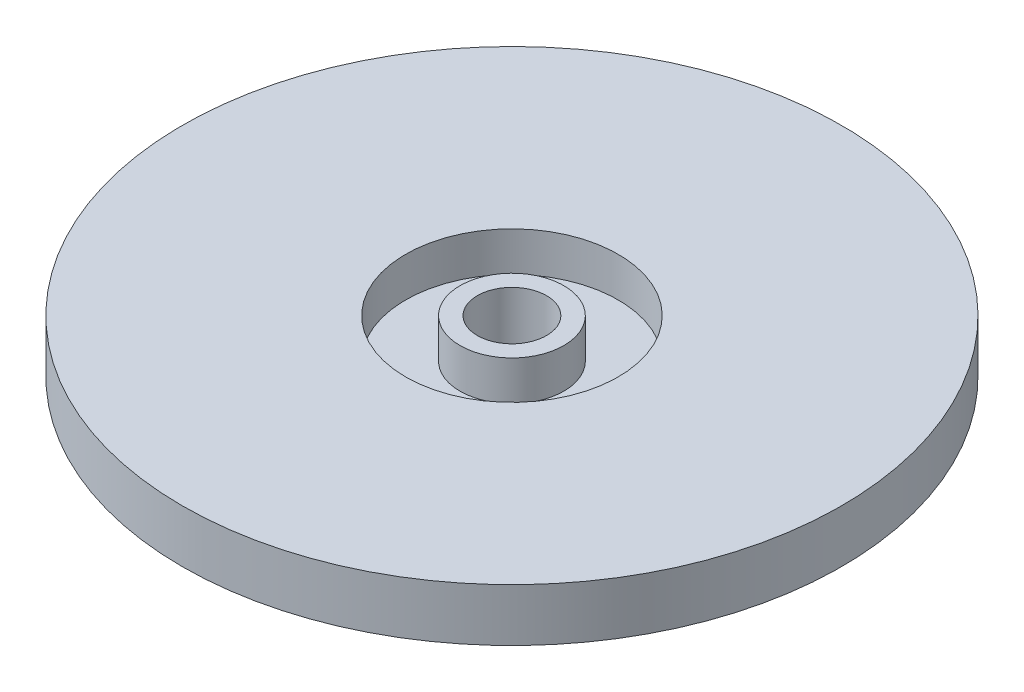
ISO-10303-21;
HEADER;
FILE_DESCRIPTION(('STEP AP214'),'2;1');
FILE_NAME('part.step','',(''),(''),'','','');
FILE_SCHEMA(('AUTOMOTIVE_DESIGN { 1 0 10303 214 1 1 1 1 }'));
ENDSEC;
DATA;
#1=APPLICATION_CONTEXT('core data for automotive mechanical design processes');
#2=APPLICATION_PROTOCOL_DEFINITION('international standard','automotive_design',2000,#1);
#3=PRODUCT_CONTEXT('',#1,'mechanical');
#4=PRODUCT('Part','Part','',(#3));
#5=PRODUCT_RELATED_PRODUCT_CATEGORY('part','',(#4));
#6=PRODUCT_DEFINITION_FORMATION('','',#4);
#7=PRODUCT_DEFINITION_CONTEXT('part definition',#1,'design');
#8=PRODUCT_DEFINITION('design','',#6,#7);
#9=PRODUCT_DEFINITION_SHAPE('','',#8);
#10=(LENGTH_UNIT() NAMED_UNIT(*) SI_UNIT(.MILLI.,.METRE.));
#11=(NAMED_UNIT(*) PLANE_ANGLE_UNIT() SI_UNIT($,.RADIAN.));
#12=(NAMED_UNIT(*) SI_UNIT($,.STERADIAN.) SOLID_ANGLE_UNIT());
#13=UNCERTAINTY_MEASURE_WITH_UNIT(LENGTH_MEASURE(1.E-05),#10,'distance_accuracy_value','');
#14=(GEOMETRIC_REPRESENTATION_CONTEXT(3) GLOBAL_UNCERTAINTY_ASSIGNED_CONTEXT((#13)) GLOBAL_UNIT_ASSIGNED_CONTEXT((#10,
#11,#12)) REPRESENTATION_CONTEXT('',''));
#15=CARTESIAN_POINT('',(0.,0.,0.));
#16=DIRECTION('',(0.,0.,1.));
#17=DIRECTION('',(1.,0.,0.));
#18=AXIS2_PLACEMENT_3D('',#15,#16,#17);
#19=CARTESIAN_POINT('',(0.,-4.,0.));
#20=DIRECTION('',(0.,1.,0.));
#21=DIRECTION('',(0.,0.,1.));
#22=AXIS2_PLACEMENT_3D('',#19,#20,#21);
#23=PLANE('',#22);
#24=CARTESIAN_POINT('',(0.,-4.,0.));
#25=DIRECTION('',(0.,1.,0.));
#26=DIRECTION('',(0.,0.,1.));
#27=AXIS2_PLACEMENT_3D('',#24,#25,#26);
#28=CIRCLE('',#27,5.25);
#29=CARTESIAN_POINT('',(0.,-4.,5.25));
#30=VERTEX_POINT('',#29);
#31=EDGE_CURVE('E58',#30,#30,#28,.T.);
#32=ORIENTED_EDGE('',*,*,#31,.T.);
#33=EDGE_LOOP('',(#32));
#34=FACE_BOUND('',#33,.T.);
#35=CARTESIAN_POINT('',(0.,-4.,0.));
#36=DIRECTION('',(0.,-1.,0.));
#37=DIRECTION('',(0.,0.,-1.));
#38=AXIS2_PLACEMENT_3D('',#35,#36,#37);
#39=CIRCLE('',#38,10.25);
#40=CARTESIAN_POINT('',(0.,-4.,-10.25));
#41=VERTEX_POINT('',#40);
#42=EDGE_CURVE('E70',#41,#41,#39,.T.);
#43=ORIENTED_EDGE('',*,*,#42,.T.);
#44=EDGE_LOOP('',(#43));
#45=FACE_BOUND('',#44,.T.);
#46=ADVANCED_FACE('F31',(#34,#45),#23,.F.);
#47=CARTESIAN_POINT('',(0.,4.,0.));
#48=DIRECTION('',(0.,-1.,0.));
#49=DIRECTION('',(0.,0.,-1.));
#50=AXIS2_PLACEMENT_3D('',#47,#48,#49);
#51=CYLINDRICAL_SURFACE('',#50,50.);
#52=CARTESIAN_POINT('',(0.,4.,0.));
#53=DIRECTION('',(0.,1.,0.));
#54=DIRECTION('',(0.,0.,1.));
#55=AXIS2_PLACEMENT_3D('',#52,#53,#54);
#56=CIRCLE('',#55,50.);
#57=CARTESIAN_POINT('',(0.,4.,50.));
#58=VERTEX_POINT('',#57);
#59=EDGE_CURVE('E38',#58,#58,#56,.T.);
#60=ORIENTED_EDGE('',*,*,#59,.F.);
#61=EDGE_LOOP('',(#60));
#62=FACE_BOUND('',#61,.T.);
#63=CARTESIAN_POINT('',(0.,-4.,0.));
#64=DIRECTION('',(0.,1.,0.));
#65=DIRECTION('',(0.,0.,1.));
#66=AXIS2_PLACEMENT_3D('',#63,#64,#65);
#67=CIRCLE('',#66,50.);
#68=CARTESIAN_POINT('',(0.,-4.,50.));
#69=VERTEX_POINT('',#68);
#70=EDGE_CURVE('E42',#69,#69,#67,.T.);
#71=ORIENTED_EDGE('',*,*,#70,.T.);
#72=EDGE_LOOP('',(#71));
#73=FACE_BOUND('',#72,.T.);
#74=ADVANCED_FACE('F33',(#62,#73),#51,.T.);
#75=CARTESIAN_POINT('',(0.,4.,0.));
#76=DIRECTION('',(0.,1.,0.));
#77=DIRECTION('',(0.,0.,1.));
#78=AXIS2_PLACEMENT_3D('',#75,#76,#77);
#79=PLANE('',#78);
#80=CARTESIAN_POINT('',(0.,4.,0.));
#81=DIRECTION('',(0.,1.,0.));
#82=DIRECTION('',(0.,0.,1.));
#83=AXIS2_PLACEMENT_3D('',#80,#81,#82);
#84=CIRCLE('',#83,16.125);
#85=CARTESIAN_POINT('',(0.,4.,16.125));
#86=VERTEX_POINT('',#85);
#87=EDGE_CURVE('E49',#86,#86,#84,.T.);
#88=ORIENTED_EDGE('',*,*,#87,.F.);
#89=EDGE_LOOP('',(#88));
#90=FACE_BOUND('',#89,.T.);
#91=ORIENTED_EDGE('',*,*,#59,.T.);
#92=EDGE_LOOP('',(#91));
#93=FACE_BOUND('',#92,.T.);
#94=ADVANCED_FACE('F101',(#90,#93),#79,.T.);
#95=CARTESIAN_POINT('',(0.,-4.,0.));
#96=DIRECTION('',(0.,1.,0.));
#97=DIRECTION('',(0.,0.,1.));
#98=AXIS2_PLACEMENT_3D('',#95,#96,#97);
#99=CIRCLE('',#98,15.25);
#100=CARTESIAN_POINT('',(0.,-4.,15.25));
#101=VERTEX_POINT('',#100);
#102=EDGE_CURVE('E10',#101,#101,#99,.F.);
#103=ORIENTED_EDGE('',*,*,#102,.F.);
#104=EDGE_LOOP('',(#103));
#105=FACE_BOUND('',#104,.T.);
#106=ORIENTED_EDGE('',*,*,#70,.F.);
#107=EDGE_LOOP('',(#106));
#108=FACE_BOUND('',#107,.T.);
#109=ADVANCED_FACE('F97',(#105,#108),#23,.F.);
#110=CARTESIAN_POINT('',(0.,-2.,0.));
#111=DIRECTION('',(0.,1.,0.));
#112=DIRECTION('',(0.,0.,1.));
#113=AXIS2_PLACEMENT_3D('',#110,#111,#112);
#114=CYLINDRICAL_SURFACE('',#113,16.125);
#115=CARTESIAN_POINT('',(0.,-2.,0.));
#116=DIRECTION('',(0.,1.,0.));
#117=DIRECTION('',(0.,0.,1.));
#118=AXIS2_PLACEMENT_3D('',#115,#116,#117);
#119=CIRCLE('',#118,16.125);
#120=CARTESIAN_POINT('',(0.,-2.,16.125));
#121=VERTEX_POINT('',#120);
#122=EDGE_CURVE('E47',#121,#121,#119,.T.);
#123=ORIENTED_EDGE('',*,*,#122,.F.);
#124=EDGE_LOOP('',(#123));
#125=FACE_BOUND('',#124,.T.);
#126=ORIENTED_EDGE('',*,*,#87,.T.);
#127=EDGE_LOOP('',(#126));
#128=FACE_BOUND('',#127,.T.);
#129=ADVANCED_FACE('F106',(#125,#128),#114,.F.);
#130=CARTESIAN_POINT('',(0.,-2.,0.));
#131=DIRECTION('',(0.,1.,0.));
#132=DIRECTION('',(0.,0.,1.));
#133=AXIS2_PLACEMENT_3D('',#130,#131,#132);
#134=PLANE('',#133);
#135=CARTESIAN_POINT('',(0.,-2.,0.));
#136=DIRECTION('',(0.,1.,0.));
#137=DIRECTION('',(0.,0.,1.));
#138=AXIS2_PLACEMENT_3D('',#135,#136,#137);
#139=CIRCLE('',#138,7.875);
#140=CARTESIAN_POINT('',(0.,-2.,7.875));
#141=VERTEX_POINT('',#140);
#142=EDGE_CURVE('E52',#141,#141,#139,.T.);
#143=ORIENTED_EDGE('',*,*,#142,.F.);
#144=EDGE_LOOP('',(#143));
#145=FACE_BOUND('',#144,.T.);
#146=ORIENTED_EDGE('',*,*,#122,.T.);
#147=EDGE_LOOP('',(#146));
#148=FACE_BOUND('',#147,.T.);
#149=ADVANCED_FACE('F112',(#145,#148),#134,.T.);
#150=CARTESIAN_POINT('',(0.,-2.,0.));
#151=DIRECTION('',(0.,1.,0.));
#152=DIRECTION('',(0.,0.,1.));
#153=AXIS2_PLACEMENT_3D('',#150,#151,#152);
#154=CYLINDRICAL_SURFACE('',#153,7.875);
#155=ORIENTED_EDGE('',*,*,#142,.T.);
#156=EDGE_LOOP('',(#155));
#157=FACE_BOUND('',#156,.T.);
#158=CARTESIAN_POINT('',(0.,4.,0.));
#159=DIRECTION('',(0.,1.,0.));
#160=DIRECTION('',(0.,0.,1.));
#161=AXIS2_PLACEMENT_3D('',#158,#159,#160);
#162=CIRCLE('',#161,7.875);
#163=CARTESIAN_POINT('',(0.,4.,7.875));
#164=VERTEX_POINT('',#163);
#165=EDGE_CURVE('E55',#164,#164,#162,.T.);
#166=ORIENTED_EDGE('',*,*,#165,.F.);
#167=EDGE_LOOP('',(#166));
#168=FACE_BOUND('',#167,.T.);
#169=ADVANCED_FACE('F123',(#157,#168),#154,.T.);
#170=CARTESIAN_POINT('',(0.,4.,0.));
#171=DIRECTION('',(0.,1.,0.));
#172=DIRECTION('',(0.,0.,1.));
#173=AXIS2_PLACEMENT_3D('',#170,#171,#172);
#174=CIRCLE('',#173,5.25);
#175=CARTESIAN_POINT('',(0.,4.,5.25));
#176=VERTEX_POINT('',#175);
#177=EDGE_CURVE('E61',#176,#176,#174,.T.);
#178=ORIENTED_EDGE('',*,*,#177,.F.);
#179=EDGE_LOOP('',(#178));
#180=FACE_BOUND('',#179,.T.);
#181=ORIENTED_EDGE('',*,*,#165,.T.);
#182=EDGE_LOOP('',(#181));
#183=FACE_BOUND('',#182,.T.);
#184=ADVANCED_FACE('F91',(#180,#183),#79,.T.);
#185=CARTESIAN_POINT('',(0.,-4.,0.));
#186=DIRECTION('',(0.,1.,0.));
#187=DIRECTION('',(0.,0.,1.));
#188=AXIS2_PLACEMENT_3D('',#185,#186,#187);
#189=CYLINDRICAL_SURFACE('',#188,5.25);
#190=ORIENTED_EDGE('',*,*,#31,.F.);
#191=EDGE_LOOP('',(#190));
#192=FACE_BOUND('',#191,.T.);
#193=ORIENTED_EDGE('',*,*,#177,.T.);
#194=EDGE_LOOP('',(#193));
#195=FACE_BOUND('',#194,.T.);
#196=ADVANCED_FACE('F82',(#192,#195),#189,.F.);
#197=CARTESIAN_POINT('',(0.,-24.,0.));
#198=DIRECTION('',(0.,-1.,0.));
#199=DIRECTION('',(0.,0.,-1.));
#200=AXIS2_PLACEMENT_3D('',#197,#198,#199);
#201=PLANE('',#200);
#202=CARTESIAN_POINT('',(0.,-24.,0.));
#203=DIRECTION('',(0.,-1.,0.));
#204=DIRECTION('',(0.,0.,-1.));
#205=AXIS2_PLACEMENT_3D('',#202,#203,#204);
#206=CIRCLE('',#205,15.25);
#207=CARTESIAN_POINT('',(0.,-24.,-15.25));
#208=VERTEX_POINT('',#207);
#209=EDGE_CURVE('E64',#208,#208,#206,.T.);
#210=ORIENTED_EDGE('',*,*,#209,.T.);
#211=EDGE_LOOP('',(#210));
#212=FACE_BOUND('',#211,.T.);
#213=CARTESIAN_POINT('',(0.,-24.,0.));
#214=DIRECTION('',(0.,-1.,0.));
#215=DIRECTION('',(0.,0.,-1.));
#216=AXIS2_PLACEMENT_3D('',#213,#214,#215);
#217=CIRCLE('',#216,10.25);
#218=CARTESIAN_POINT('',(0.,-24.,-10.25));
#219=VERTEX_POINT('',#218);
#220=EDGE_CURVE('E69',#219,#219,#217,.T.);
#221=ORIENTED_EDGE('',*,*,#220,.F.);
#222=EDGE_LOOP('',(#221));
#223=FACE_BOUND('',#222,.T.);
#224=ADVANCED_FACE('F79',(#212,#223),#201,.T.);
#225=CARTESIAN_POINT('',(0.,-24.,0.));
#226=DIRECTION('',(0.,1.,0.));
#227=DIRECTION('',(0.,0.,1.));
#228=AXIS2_PLACEMENT_3D('',#225,#226,#227);
#229=CYLINDRICAL_SURFACE('',#228,15.25);
#230=ORIENTED_EDGE('',*,*,#209,.F.);
#231=EDGE_LOOP('',(#230));
#232=FACE_BOUND('',#231,.T.);
#233=ORIENTED_EDGE('',*,*,#102,.T.);
#234=EDGE_LOOP('',(#233));
#235=FACE_BOUND('',#234,.T.);
#236=ADVANCED_FACE('F81',(#232,#235),#229,.T.);
#237=CARTESIAN_POINT('',(0.,-24.,0.));
#238=DIRECTION('',(0.,1.,0.));
#239=DIRECTION('',(0.,0.,1.));
#240=AXIS2_PLACEMENT_3D('',#237,#238,#239);
#241=CYLINDRICAL_SURFACE('',#240,10.25);
#242=ORIENTED_EDGE('',*,*,#220,.T.);
#243=EDGE_LOOP('',(#242));
#244=FACE_BOUND('',#243,.T.);
#245=ORIENTED_EDGE('',*,*,#42,.F.);
#246=EDGE_LOOP('',(#245));
#247=FACE_BOUND('',#246,.T.);
#248=ADVANCED_FACE('F76',(#244,#247),#241,.F.);
#249=CLOSED_SHELL('',(#46,#74,#94,#109,#129,#149,#169,#184,#196,#224,#236,#248));
#250=MANIFOLD_SOLID_BREP('B2',#249);
#251=ADVANCED_BREP_SHAPE_REPRESENTATION('',(#18,#250),#14);
#252=SHAPE_DEFINITION_REPRESENTATION(#9,#251);
ENDSEC;
END-ISO-10303-21;
